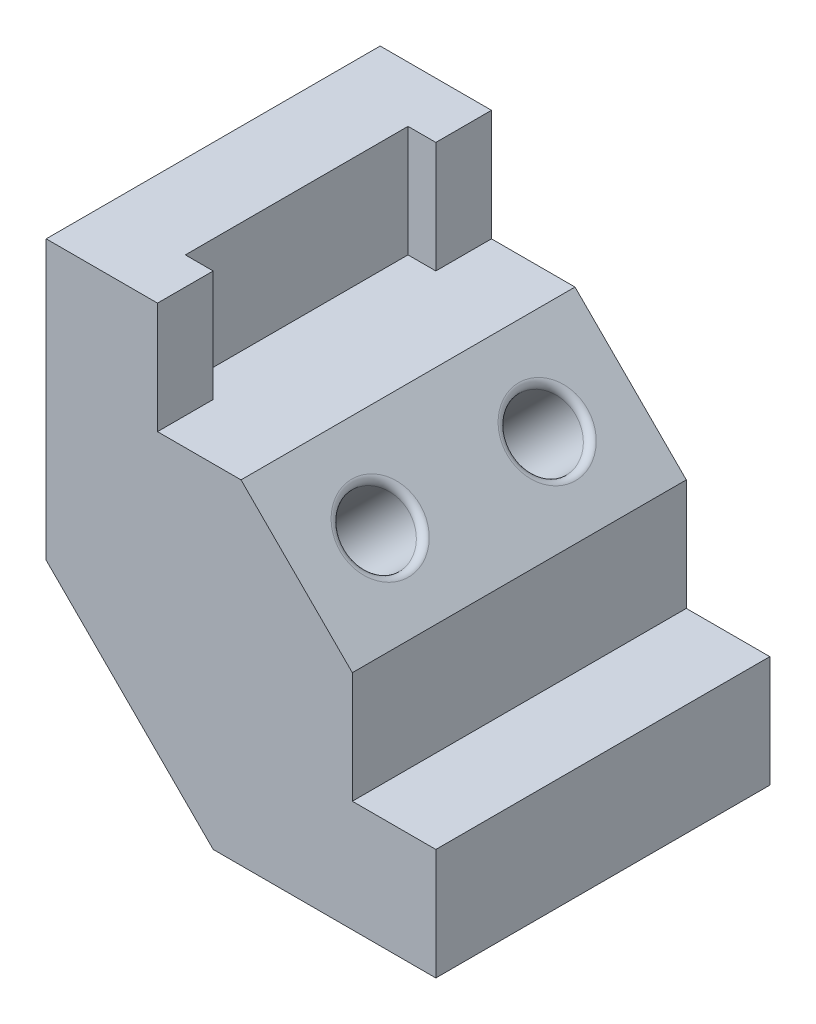
ISO-10303-21;
HEADER;
FILE_DESCRIPTION(('STEP AP214'),'2;1');
FILE_NAME('part.step','',(''),(''),'','','');
FILE_SCHEMA(('AUTOMOTIVE_DESIGN { 1 0 10303 214 1 1 1 1 }'));
ENDSEC;
DATA;
#1=APPLICATION_CONTEXT('core data for automotive mechanical design processes');
#2=APPLICATION_PROTOCOL_DEFINITION('international standard','automotive_design',2000,#1);
#3=PRODUCT_CONTEXT('',#1,'mechanical');
#4=PRODUCT('Part','Part','',(#3));
#5=PRODUCT_RELATED_PRODUCT_CATEGORY('part','',(#4));
#6=PRODUCT_DEFINITION_FORMATION('','',#4);
#7=PRODUCT_DEFINITION_CONTEXT('part definition',#1,'design');
#8=PRODUCT_DEFINITION('design','',#6,#7);
#9=PRODUCT_DEFINITION_SHAPE('','',#8);
#10=(LENGTH_UNIT() NAMED_UNIT(*) SI_UNIT(.MILLI.,.METRE.));
#11=(NAMED_UNIT(*) PLANE_ANGLE_UNIT() SI_UNIT($,.RADIAN.));
#12=(NAMED_UNIT(*) SI_UNIT($,.STERADIAN.) SOLID_ANGLE_UNIT());
#13=UNCERTAINTY_MEASURE_WITH_UNIT(LENGTH_MEASURE(1.E-05),#10,'distance_accuracy_value','');
#14=(GEOMETRIC_REPRESENTATION_CONTEXT(3) GLOBAL_UNCERTAINTY_ASSIGNED_CONTEXT((#13)) GLOBAL_UNIT_ASSIGNED_CONTEXT((#10,
#11,#12)) REPRESENTATION_CONTEXT('',''));
#15=CARTESIAN_POINT('',(0.,0.,0.));
#16=DIRECTION('',(0.,0.,1.));
#17=DIRECTION('',(1.,0.,0.));
#18=AXIS2_PLACEMENT_3D('',#15,#16,#17);
#19=CARTESIAN_POINT('',(25.4,22.9513180452887,-76.2));
#20=DIRECTION('',(1.,0.,0.));
#21=DIRECTION('',(0.,0.,-1.));
#22=AXIS2_PLACEMENT_3D('',#19,#20,#21);
#23=PLANE('',#22);
#24=DIRECTION('',(0.,1.,0.));
#25=VECTOR('',#24,1.);
#26=CARTESIAN_POINT('',(25.4,-28.2440186564071,-63.5));
#27=LINE('',#26,#25);
#28=CARTESIAN_POINT('',(25.4,22.9513180452887,-63.5));
#29=VERTEX_POINT('',#28);
#30=CARTESIAN_POINT('',(25.4,48.3513180452887,-63.5));
#31=VERTEX_POINT('',#30);
#32=EDGE_CURVE('E247',#29,#31,#27,.T.);
#33=ORIENTED_EDGE('',*,*,#32,.F.);
#34=DIRECTION('',(0.,0.,1.));
#35=VECTOR('',#34,1.);
#36=CARTESIAN_POINT('',(25.4,22.9513180452887,-76.2));
#37=LINE('',#36,#35);
#38=CARTESIAN_POINT('',(25.4,22.9513180452887,-76.2));
#39=VERTEX_POINT('',#38);
#40=EDGE_CURVE('E199',#39,#29,#37,.T.);
#41=ORIENTED_EDGE('',*,*,#40,.F.);
#42=DIRECTION('',(0.,1.,0.));
#43=VECTOR('',#42,1.);
#44=CARTESIAN_POINT('',(25.4,22.9513180452887,-76.2));
#45=LINE('',#44,#43);
#46=CARTESIAN_POINT('',(25.4,48.3513180452887,-76.2));
#47=VERTEX_POINT('',#46);
#48=EDGE_CURVE('E158',#39,#47,#45,.T.);
#49=ORIENTED_EDGE('',*,*,#48,.T.);
#50=DIRECTION('',(0.,0.,1.));
#51=VECTOR('',#50,1.);
#52=CARTESIAN_POINT('',(25.4,48.3513180452887,-76.2));
#53=LINE('',#52,#51);
#54=EDGE_CURVE('E63',#47,#31,#53,.T.);
#55=ORIENTED_EDGE('',*,*,#54,.T.);
#56=EDGE_LOOP('',(#33,#41,#49,#55));
#57=FACE_BOUND('',#56,.T.);
#58=ADVANCED_FACE('F39',(#57),#23,.T.);
#59=CARTESIAN_POINT('',(25.4,48.3513180452887,-76.2));
#60=DIRECTION('',(0.,1.,0.));
#61=DIRECTION('',(-1.,0.,0.));
#62=AXIS2_PLACEMENT_3D('',#59,#60,#61);
#63=PLANE('',#62);
#64=DIRECTION('',(-1.,0.,0.));
#65=VECTOR('',#64,1.);
#66=CARTESIAN_POINT('',(25.4,48.3513180452887,-63.5));
#67=LINE('',#66,#65);
#68=CARTESIAN_POINT('',(19.05,48.3513180452887,-63.5));
#69=VERTEX_POINT('',#68);
#70=EDGE_CURVE('E241',#31,#69,#67,.T.);
#71=ORIENTED_EDGE('',*,*,#70,.F.);
#72=ORIENTED_EDGE('',*,*,#54,.F.);
#73=DIRECTION('',(-1.,0.,0.));
#74=VECTOR('',#73,1.);
#75=CARTESIAN_POINT('',(25.4,48.3513180452887,-76.2));
#76=LINE('',#75,#74);
#77=CARTESIAN_POINT('',(0.,48.3513180452887,-76.2));
#78=VERTEX_POINT('',#77);
#79=EDGE_CURVE('E196',#47,#78,#76,.T.);
#80=ORIENTED_EDGE('',*,*,#79,.T.);
#81=DIRECTION('',(0.,0.,1.));
#82=VECTOR('',#81,1.);
#83=CARTESIAN_POINT('',(0.,48.3513180452887,-76.2));
#84=LINE('',#83,#82);
#85=CARTESIAN_POINT('',(0.,48.3513180452887,0.));
#86=VERTEX_POINT('',#85);
#87=EDGE_CURVE('E111',#78,#86,#84,.T.);
#88=ORIENTED_EDGE('',*,*,#87,.T.);
#89=DIRECTION('',(-1.,0.,0.));
#90=VECTOR('',#89,1.);
#91=CARTESIAN_POINT('',(25.4,48.3513180452887,0.));
#92=LINE('',#91,#90);
#93=CARTESIAN_POINT('',(25.4,48.3513180452887,0.));
#94=VERTEX_POINT('',#93);
#95=EDGE_CURVE('E168',#94,#86,#92,.T.);
#96=ORIENTED_EDGE('',*,*,#95,.F.);
#97=CARTESIAN_POINT('',(25.4,48.3513180452887,-12.7));
#98=VERTEX_POINT('',#97);
#99=EDGE_CURVE('E103',#98,#94,#53,.T.);
#100=ORIENTED_EDGE('',*,*,#99,.F.);
#101=DIRECTION('',(1.,0.,0.));
#102=VECTOR('',#101,1.);
#103=CARTESIAN_POINT('',(25.4,48.3513180452887,-12.7));
#104=LINE('',#103,#102);
#105=CARTESIAN_POINT('',(19.05,48.3513180452887,-12.7));
#106=VERTEX_POINT('',#105);
#107=EDGE_CURVE('E255',#106,#98,#104,.T.);
#108=ORIENTED_EDGE('',*,*,#107,.F.);
#109=DIRECTION('',(0.,0.,1.));
#110=VECTOR('',#109,1.);
#111=CARTESIAN_POINT('',(19.05,48.3513180452887,-63.5));
#112=LINE('',#111,#110);
#113=EDGE_CURVE('E252',#69,#106,#112,.T.);
#114=ORIENTED_EDGE('',*,*,#113,.F.);
#115=EDGE_LOOP('',(#71,#72,#80,#88,#96,#100,#108,#114));
#116=FACE_BOUND('',#115,.T.);
#117=ADVANCED_FACE('F298',(#116),#63,.T.);
#118=DIRECTION('',(0.,1.,0.));
#119=VECTOR('',#118,1.);
#120=CARTESIAN_POINT('',(25.4,-28.2440186564071,-12.7));
#121=LINE('',#120,#119);
#122=CARTESIAN_POINT('',(25.4,22.9513180452887,-12.7));
#123=VERTEX_POINT('',#122);
#124=EDGE_CURVE('E54',#123,#98,#121,.T.);
#125=ORIENTED_EDGE('',*,*,#124,.T.);
#126=ORIENTED_EDGE('',*,*,#99,.T.);
#127=DIRECTION('',(0.,1.,0.));
#128=VECTOR('',#127,1.);
#129=CARTESIAN_POINT('',(25.4,22.9513180452887,0.));
#130=LINE('',#129,#128);
#131=CARTESIAN_POINT('',(25.4,22.9513180452887,0.));
#132=VERTEX_POINT('',#131);
#133=EDGE_CURVE('E193',#132,#94,#130,.T.);
#134=ORIENTED_EDGE('',*,*,#133,.F.);
#135=EDGE_CURVE('E148',#123,#132,#37,.T.);
#136=ORIENTED_EDGE('',*,*,#135,.F.);
#137=EDGE_LOOP('',(#125,#126,#134,#136));
#138=FACE_BOUND('',#137,.T.);
#139=ADVANCED_FACE('F304',(#138),#23,.T.);
#140=CARTESIAN_POINT('',(44.45,22.9513180452887,-76.2));
#141=DIRECTION('',(0.,1.,0.));
#142=DIRECTION('',(-1.,0.,0.));
#143=AXIS2_PLACEMENT_3D('',#140,#141,#142);
#144=PLANE('',#143);
#145=DIRECTION('',(-1.,0.,0.));
#146=VECTOR('',#145,1.);
#147=CARTESIAN_POINT('',(44.45,22.9513180452887,0.));
#148=LINE('',#147,#146);
#149=CARTESIAN_POINT('',(44.45,22.9513180452887,0.));
#150=VERTEX_POINT('',#149);
#151=EDGE_CURVE('E143',#150,#132,#148,.T.);
#152=ORIENTED_EDGE('',*,*,#151,.F.);
#153=DIRECTION('',(0.,0.,1.));
#154=VECTOR('',#153,1.);
#155=CARTESIAN_POINT('',(44.45,22.9513180452887,-76.2));
#156=LINE('',#155,#154);
#157=CARTESIAN_POINT('',(44.45,22.9513180452887,-76.2));
#158=VERTEX_POINT('',#157);
#159=EDGE_CURVE('E136',#158,#150,#156,.T.);
#160=ORIENTED_EDGE('',*,*,#159,.F.);
#161=DIRECTION('',(-1.,0.,0.));
#162=VECTOR('',#161,1.);
#163=CARTESIAN_POINT('',(44.45,22.9513180452887,-76.2));
#164=LINE('',#163,#162);
#165=EDGE_CURVE('E140',#158,#39,#164,.T.);
#166=ORIENTED_EDGE('',*,*,#165,.T.);
#167=ORIENTED_EDGE('',*,*,#40,.T.);
#168=DIRECTION('',(1.,0.,0.));
#169=VECTOR('',#168,1.);
#170=CARTESIAN_POINT('',(25.4,22.9513180452887,-63.5));
#171=LINE('',#170,#169);
#172=CARTESIAN_POINT('',(19.05,22.9513180452887,-63.5));
#173=VERTEX_POINT('',#172);
#174=EDGE_CURVE('E246',#173,#29,#171,.T.);
#175=ORIENTED_EDGE('',*,*,#174,.F.);
#176=DIRECTION('',(0.,0.,-1.));
#177=VECTOR('',#176,1.);
#178=CARTESIAN_POINT('',(19.05,22.9513180452887,-63.5));
#179=LINE('',#178,#177);
#180=CARTESIAN_POINT('',(19.05,22.9513180452887,-12.7));
#181=VERTEX_POINT('',#180);
#182=EDGE_CURVE('E172',#181,#173,#179,.T.);
#183=ORIENTED_EDGE('',*,*,#182,.F.);
#184=DIRECTION('',(-1.,0.,0.));
#185=VECTOR('',#184,1.);
#186=CARTESIAN_POINT('',(25.4,22.9513180452887,-12.7));
#187=LINE('',#186,#185);
#188=EDGE_CURVE('E244',#123,#181,#187,.T.);
#189=ORIENTED_EDGE('',*,*,#188,.F.);
#190=ORIENTED_EDGE('',*,*,#135,.T.);
#191=EDGE_LOOP('',(#152,#160,#166,#167,#175,#183,#189,#190));
#192=FACE_BOUND('',#191,.T.);
#193=ADVANCED_FACE('F138',(#192),#144,.T.);
#194=CARTESIAN_POINT('',(69.8499999999999,-2.44868195471128,-76.2));
#195=DIRECTION('',(0.707106781186549,0.707106781186546,0.));
#196=DIRECTION('',(-0.707106781186546,0.707106781186549,0.));
#197=AXIS2_PLACEMENT_3D('',#194,#195,#196);
#198=PLANE('',#197);
#199=CARTESIAN_POINT('',(57.1519178448082,10.2494002004805,-57.15));
#200=DIRECTION('',(0.707106781186549,0.707106781186546,0.));
#201=DIRECTION('',(-0.707106781186546,0.707106781186549,0.));
#202=AXIS2_PLACEMENT_3D('',#199,#200,#201);
#203=CIRCLE('',#202,9.14399999999999);
#204=CARTESIAN_POINT('',(50.6861334376384,16.7151846076503,-57.15));
#205=VERTEX_POINT('',#204);
#206=EDGE_CURVE('E47',#205,#205,#203,.F.);
#207=ORIENTED_EDGE('',*,*,#206,.T.);
#208=EDGE_LOOP('',(#207));
#209=FACE_BOUND('',#208,.T.);
#210=CARTESIAN_POINT('',(57.1519178448082,10.2494002004805,-19.05));
#211=DIRECTION('',(0.707106781186549,0.707106781186546,0.));
#212=DIRECTION('',(-0.707106781186546,0.707106781186549,0.));
#213=AXIS2_PLACEMENT_3D('',#210,#211,#212);
#214=CIRCLE('',#213,9.144);
#215=CARTESIAN_POINT('',(50.6861334376384,16.7151846076503,-19.05));
#216=VERTEX_POINT('',#215);
#217=EDGE_CURVE('E215',#216,#216,#214,.F.);
#218=ORIENTED_EDGE('',*,*,#217,.T.);
#219=EDGE_LOOP('',(#218));
#220=FACE_BOUND('',#219,.T.);
#221=DIRECTION('',(-0.707106781186546,0.707106781186549,0.));
#222=VECTOR('',#221,1.);
#223=CARTESIAN_POINT('',(69.8499999999999,-2.44868195471128,0.));
#224=LINE('',#223,#222);
#225=CARTESIAN_POINT('',(69.8499999999999,-2.44868195471128,0.));
#226=VERTEX_POINT('',#225);
#227=EDGE_CURVE('E190',#226,#150,#224,.T.);
#228=ORIENTED_EDGE('',*,*,#227,.F.);
#229=DIRECTION('',(0.,0.,1.));
#230=VECTOR('',#229,1.);
#231=CARTESIAN_POINT('',(69.8499999999999,-2.44868195471128,-76.2));
#232=LINE('',#231,#230);
#233=CARTESIAN_POINT('',(69.8499999999999,-2.44868195471128,-76.2));
#234=VERTEX_POINT('',#233);
#235=EDGE_CURVE('E149',#234,#226,#232,.T.);
#236=ORIENTED_EDGE('',*,*,#235,.F.);
#237=DIRECTION('',(-0.707106781186546,0.707106781186549,0.));
#238=VECTOR('',#237,1.);
#239=CARTESIAN_POINT('',(69.8499999999999,-2.44868195471128,-76.2));
#240=LINE('',#239,#238);
#241=EDGE_CURVE('E155',#234,#158,#240,.T.);
#242=ORIENTED_EDGE('',*,*,#241,.T.);
#243=ORIENTED_EDGE('',*,*,#159,.T.);
#244=EDGE_LOOP('',(#228,#236,#242,#243));
#245=FACE_BOUND('',#244,.T.);
#246=ADVANCED_FACE('F160',(#209,#220,#245),#198,.T.);
#247=CARTESIAN_POINT('',(69.8499999999999,-27.8486819547113,-76.2));
#248=DIRECTION('',(1.,0.,0.));
#249=DIRECTION('',(0.,0.,-1.));
#250=AXIS2_PLACEMENT_3D('',#247,#248,#249);
#251=PLANE('',#250);
#252=DIRECTION('',(0.,1.,0.));
#253=VECTOR('',#252,1.);
#254=CARTESIAN_POINT('',(69.8499999999999,-27.8486819547113,0.));
#255=LINE('',#254,#253);
#256=CARTESIAN_POINT('',(69.8499999999999,-27.8486819547113,0.));
#257=VERTEX_POINT('',#256);
#258=EDGE_CURVE('E187',#257,#226,#255,.T.);
#259=ORIENTED_EDGE('',*,*,#258,.F.);
#260=DIRECTION('',(0.,0.,1.));
#261=VECTOR('',#260,1.);
#262=CARTESIAN_POINT('',(69.8499999999999,-27.8486819547113,-76.2));
#263=LINE('',#262,#261);
#264=CARTESIAN_POINT('',(69.8499999999999,-27.8486819547113,-76.2));
#265=VERTEX_POINT('',#264);
#266=EDGE_CURVE('E202',#265,#257,#263,.T.);
#267=ORIENTED_EDGE('',*,*,#266,.F.);
#268=DIRECTION('',(0.,1.,0.));
#269=VECTOR('',#268,1.);
#270=CARTESIAN_POINT('',(69.8499999999999,-27.8486819547113,-76.2));
#271=LINE('',#270,#269);
#272=EDGE_CURVE('E161',#265,#234,#271,.T.);
#273=ORIENTED_EDGE('',*,*,#272,.T.);
#274=ORIENTED_EDGE('',*,*,#235,.T.);
#275=EDGE_LOOP('',(#259,#267,#273,#274));
#276=FACE_BOUND('',#275,.T.);
#277=ADVANCED_FACE('F343',(#276),#251,.T.);
#278=CARTESIAN_POINT('',(88.9,-27.8486819547113,-76.2));
#279=DIRECTION('',(0.,1.,0.));
#280=DIRECTION('',(0.,0.,1.));
#281=AXIS2_PLACEMENT_3D('',#278,#279,#280);
#282=PLANE('',#281);
#283=DIRECTION('',(-1.,0.,0.));
#284=VECTOR('',#283,1.);
#285=CARTESIAN_POINT('',(88.9,-27.8486819547113,0.));
#286=LINE('',#285,#284);
#287=CARTESIAN_POINT('',(88.9,-27.8486819547113,0.));
#288=VERTEX_POINT('',#287);
#289=EDGE_CURVE('E184',#288,#257,#286,.T.);
#290=ORIENTED_EDGE('',*,*,#289,.F.);
#291=DIRECTION('',(0.,0.,1.));
#292=VECTOR('',#291,1.);
#293=CARTESIAN_POINT('',(88.9,-27.8486819547113,-76.2));
#294=LINE('',#293,#292);
#295=CARTESIAN_POINT('',(88.9,-27.8486819547113,-76.2));
#296=VERTEX_POINT('',#295);
#297=EDGE_CURVE('E204',#296,#288,#294,.T.);
#298=ORIENTED_EDGE('',*,*,#297,.F.);
#299=DIRECTION('',(-1.,0.,0.));
#300=VECTOR('',#299,1.);
#301=CARTESIAN_POINT('',(88.9,-27.8486819547113,-76.2));
#302=LINE('',#301,#300);
#303=EDGE_CURVE('E163',#296,#265,#302,.T.);
#304=ORIENTED_EDGE('',*,*,#303,.T.);
#305=ORIENTED_EDGE('',*,*,#266,.T.);
#306=EDGE_LOOP('',(#290,#298,#304,#305));
#307=FACE_BOUND('',#306,.T.);
#308=ADVANCED_FACE('F283',(#307),#282,.T.);
#309=CARTESIAN_POINT('',(88.9,-53.2486819547113,-76.2));
#310=DIRECTION('',(1.,0.,0.));
#311=DIRECTION('',(0.,1.,0.));
#312=AXIS2_PLACEMENT_3D('',#309,#310,#311);
#313=PLANE('',#312);
#314=DIRECTION('',(0.,1.,0.));
#315=VECTOR('',#314,1.);
#316=CARTESIAN_POINT('',(88.9,-53.2486819547113,0.));
#317=LINE('',#316,#315);
#318=CARTESIAN_POINT('',(88.9,-53.2486819547113,0.));
#319=VERTEX_POINT('',#318);
#320=EDGE_CURVE('E181',#319,#288,#317,.T.);
#321=ORIENTED_EDGE('',*,*,#320,.F.);
#322=DIRECTION('',(0.,0.,1.));
#323=VECTOR('',#322,1.);
#324=CARTESIAN_POINT('',(88.9,-53.2486819547113,-76.2));
#325=LINE('',#324,#323);
#326=CARTESIAN_POINT('',(88.9,-53.2486819547113,-76.2));
#327=VERTEX_POINT('',#326);
#328=EDGE_CURVE('E206',#327,#319,#325,.T.);
#329=ORIENTED_EDGE('',*,*,#328,.F.);
#330=DIRECTION('',(0.,1.,0.));
#331=VECTOR('',#330,1.);
#332=CARTESIAN_POINT('',(88.9,-53.2486819547113,-76.2));
#333=LINE('',#332,#331);
#334=EDGE_CURVE('E277',#327,#296,#333,.T.);
#335=ORIENTED_EDGE('',*,*,#334,.T.);
#336=ORIENTED_EDGE('',*,*,#297,.T.);
#337=EDGE_LOOP('',(#321,#329,#335,#336));
#338=FACE_BOUND('',#337,.T.);
#339=ADVANCED_FACE('F289',(#338),#313,.T.);
#340=CARTESIAN_POINT('',(38.1,-53.2486819547113,-76.2));
#341=DIRECTION('',(0.,-1.,0.));
#342=DIRECTION('',(1.,0.,0.));
#343=AXIS2_PLACEMENT_3D('',#340,#341,#342);
#344=PLANE('',#343);
#345=DIRECTION('',(1.,0.,0.));
#346=VECTOR('',#345,1.);
#347=CARTESIAN_POINT('',(38.1,-53.2486819547113,0.));
#348=LINE('',#347,#346);
#349=CARTESIAN_POINT('',(38.1,-53.2486819547113,0.));
#350=VERTEX_POINT('',#349);
#351=EDGE_CURVE('E178',#350,#319,#348,.T.);
#352=ORIENTED_EDGE('',*,*,#351,.F.);
#353=DIRECTION('',(0.,0.,1.));
#354=VECTOR('',#353,1.);
#355=CARTESIAN_POINT('',(38.1,-53.2486819547113,-76.2));
#356=LINE('',#355,#354);
#357=CARTESIAN_POINT('',(38.1,-53.2486819547113,-76.2));
#358=VERTEX_POINT('',#357);
#359=EDGE_CURVE('E208',#358,#350,#356,.T.);
#360=ORIENTED_EDGE('',*,*,#359,.F.);
#361=DIRECTION('',(1.,0.,0.));
#362=VECTOR('',#361,1.);
#363=CARTESIAN_POINT('',(38.1,-53.2486819547113,-76.2));
#364=LINE('',#363,#362);
#365=EDGE_CURVE('E274',#358,#327,#364,.T.);
#366=ORIENTED_EDGE('',*,*,#365,.T.);
#367=ORIENTED_EDGE('',*,*,#328,.T.);
#368=EDGE_LOOP('',(#352,#360,#366,#367));
#369=FACE_BOUND('',#368,.T.);
#370=ADVANCED_FACE('F292',(#369),#344,.T.);
#371=CARTESIAN_POINT('',(0.,-15.1486819547111,-76.2));
#372=DIRECTION('',(-0.707106781186549,-0.707106781186546,0.));
#373=DIRECTION('',(0.707106781186546,-0.707106781186549,0.));
#374=AXIS2_PLACEMENT_3D('',#371,#372,#373);
#375=PLANE('',#374);
#376=DIRECTION('',(0.707106781186546,-0.707106781186549,0.));
#377=VECTOR('',#376,1.);
#378=CARTESIAN_POINT('',(0.,-15.1486819547111,0.));
#379=LINE('',#378,#377);
#380=CARTESIAN_POINT('',(0.,-15.1486819547111,0.));
#381=VERTEX_POINT('',#380);
#382=EDGE_CURVE('E175',#381,#350,#379,.T.);
#383=ORIENTED_EDGE('',*,*,#382,.F.);
#384=DIRECTION('',(0.,0.,1.));
#385=VECTOR('',#384,1.);
#386=CARTESIAN_POINT('',(0.,-15.1486819547111,-76.2));
#387=LINE('',#386,#385);
#388=CARTESIAN_POINT('',(0.,-15.1486819547111,-76.2));
#389=VERTEX_POINT('',#388);
#390=EDGE_CURVE('E210',#389,#381,#387,.T.);
#391=ORIENTED_EDGE('',*,*,#390,.F.);
#392=DIRECTION('',(0.707106781186546,-0.707106781186549,0.));
#393=VECTOR('',#392,1.);
#394=CARTESIAN_POINT('',(0.,-15.1486819547111,-76.2));
#395=LINE('',#394,#393);
#396=EDGE_CURVE('E271',#389,#358,#395,.T.);
#397=ORIENTED_EDGE('',*,*,#396,.T.);
#398=ORIENTED_EDGE('',*,*,#359,.T.);
#399=EDGE_LOOP('',(#383,#391,#397,#398));
#400=FACE_BOUND('',#399,.T.);
#401=ADVANCED_FACE('F296',(#400),#375,.T.);
#402=CARTESIAN_POINT('',(0.,48.3513180452887,-76.2));
#403=DIRECTION('',(-1.,0.,0.));
#404=DIRECTION('',(0.,-1.,0.));
#405=AXIS2_PLACEMENT_3D('',#402,#403,#404);
#406=PLANE('',#405);
#407=DIRECTION('',(0.,-1.,0.));
#408=VECTOR('',#407,1.);
#409=CARTESIAN_POINT('',(0.,48.3513180452887,0.));
#410=LINE('',#409,#408);
#411=EDGE_CURVE('E171',#86,#381,#410,.T.);
#412=ORIENTED_EDGE('',*,*,#411,.F.);
#413=ORIENTED_EDGE('',*,*,#87,.F.);
#414=DIRECTION('',(0.,-1.,0.));
#415=VECTOR('',#414,1.);
#416=CARTESIAN_POINT('',(0.,48.3513180452887,-76.2));
#417=LINE('',#416,#415);
#418=EDGE_CURVE('E269',#78,#389,#417,.T.);
#419=ORIENTED_EDGE('',*,*,#418,.T.);
#420=ORIENTED_EDGE('',*,*,#390,.T.);
#421=EDGE_LOOP('',(#412,#413,#419,#420));
#422=FACE_BOUND('',#421,.T.);
#423=ADVANCED_FACE('F297',(#422),#406,.T.);
#424=CARTESIAN_POINT('',(0.,0.,-76.2));
#425=DIRECTION('',(0.,0.,1.));
#426=DIRECTION('',(1.,0.,0.));
#427=AXIS2_PLACEMENT_3D('',#424,#425,#426);
#428=PLANE('',#427);
#429=ORIENTED_EDGE('',*,*,#79,.F.);
#430=ORIENTED_EDGE('',*,*,#48,.F.);
#431=ORIENTED_EDGE('',*,*,#165,.F.);
#432=ORIENTED_EDGE('',*,*,#241,.F.);
#433=ORIENTED_EDGE('',*,*,#272,.F.);
#434=ORIENTED_EDGE('',*,*,#303,.F.);
#435=ORIENTED_EDGE('',*,*,#334,.F.);
#436=ORIENTED_EDGE('',*,*,#365,.F.);
#437=ORIENTED_EDGE('',*,*,#396,.F.);
#438=ORIENTED_EDGE('',*,*,#418,.F.);
#439=EDGE_LOOP('',(#429,#430,#431,#432,#433,#434,#435,#436,#437,#438));
#440=FACE_BOUND('',#439,.T.);
#441=ADVANCED_FACE('F153',(#440),#428,.F.);
#442=CARTESIAN_POINT('',(0.,0.,0.));
#443=DIRECTION('',(0.,0.,1.));
#444=DIRECTION('',(1.,0.,0.));
#445=AXIS2_PLACEMENT_3D('',#442,#443,#444);
#446=PLANE('',#445);
#447=ORIENTED_EDGE('',*,*,#95,.T.);
#448=ORIENTED_EDGE('',*,*,#411,.T.);
#449=ORIENTED_EDGE('',*,*,#382,.T.);
#450=ORIENTED_EDGE('',*,*,#351,.T.);
#451=ORIENTED_EDGE('',*,*,#320,.T.);
#452=ORIENTED_EDGE('',*,*,#289,.T.);
#453=ORIENTED_EDGE('',*,*,#258,.T.);
#454=ORIENTED_EDGE('',*,*,#227,.T.);
#455=ORIENTED_EDGE('',*,*,#151,.T.);
#456=ORIENTED_EDGE('',*,*,#133,.T.);
#457=EDGE_LOOP('',(#447,#448,#449,#450,#451,#452,#453,#454,#455,#456));
#458=FACE_BOUND('',#457,.T.);
#459=ADVANCED_FACE('F302',(#458),#446,.T.);
#460=CARTESIAN_POINT('',(25.4,-28.2440186564071,-63.5));
#461=DIRECTION('',(0.,0.,-1.));
#462=DIRECTION('',(-1.,0.,0.));
#463=AXIS2_PLACEMENT_3D('',#460,#461,#462);
#464=PLANE('',#463);
#465=ORIENTED_EDGE('',*,*,#174,.T.);
#466=ORIENTED_EDGE('',*,*,#32,.T.);
#467=ORIENTED_EDGE('',*,*,#70,.T.);
#468=DIRECTION('',(0.,1.,0.));
#469=VECTOR('',#468,1.);
#470=CARTESIAN_POINT('',(19.05,-28.2440186564071,-63.5));
#471=LINE('',#470,#469);
#472=EDGE_CURVE('E257',#173,#69,#471,.T.);
#473=ORIENTED_EDGE('',*,*,#472,.F.);
#474=EDGE_LOOP('',(#465,#466,#467,#473));
#475=FACE_BOUND('',#474,.T.);
#476=ADVANCED_FACE('F324',(#475),#464,.F.);
#477=CARTESIAN_POINT('',(25.4,-28.2440186564071,-12.7));
#478=DIRECTION('',(0.,0.,1.));
#479=DIRECTION('',(1.,0.,0.));
#480=AXIS2_PLACEMENT_3D('',#477,#478,#479);
#481=PLANE('',#480);
#482=ORIENTED_EDGE('',*,*,#188,.T.);
#483=DIRECTION('',(0.,1.,0.));
#484=VECTOR('',#483,1.);
#485=CARTESIAN_POINT('',(19.05,-28.2440186564071,-12.7));
#486=LINE('',#485,#484);
#487=EDGE_CURVE('E261',#181,#106,#486,.T.);
#488=ORIENTED_EDGE('',*,*,#487,.T.);
#489=ORIENTED_EDGE('',*,*,#107,.T.);
#490=ORIENTED_EDGE('',*,*,#124,.F.);
#491=EDGE_LOOP('',(#482,#488,#489,#490));
#492=FACE_BOUND('',#491,.T.);
#493=ADVANCED_FACE('F309',(#492),#481,.F.);
#494=CARTESIAN_POINT('',(19.05,-28.2440186564071,-63.5));
#495=DIRECTION('',(-1.,0.,0.));
#496=DIRECTION('',(0.,-1.,0.));
#497=AXIS2_PLACEMENT_3D('',#494,#495,#496);
#498=PLANE('',#497);
#499=ORIENTED_EDGE('',*,*,#182,.T.);
#500=ORIENTED_EDGE('',*,*,#472,.T.);
#501=ORIENTED_EDGE('',*,*,#113,.T.);
#502=ORIENTED_EDGE('',*,*,#487,.F.);
#503=EDGE_LOOP('',(#499,#500,#501,#502));
#504=FACE_BOUND('',#503,.T.);
#505=ADVANCED_FACE('F232',(#504),#498,.F.);
#506=CARTESIAN_POINT('',(19.4348421363176,-27.4676755080098,-57.15));
#507=DIRECTION('',(0.707106781186549,0.707106781186546,0.));
#508=DIRECTION('',(-0.707106781186546,0.707106781186549,0.));
#509=AXIS2_PLACEMENT_3D('',#506,#507,#508);
#510=CYLINDRICAL_SURFACE('',#509,7.61999999999999);
#511=CARTESIAN_POINT('',(56.0742871102799,9.17176946595225,-57.15));
#512=DIRECTION('',(0.707106781186549,0.707106781186546,0.));
#513=DIRECTION('',(-0.707106781186546,0.707106781186549,0.));
#514=AXIS2_PLACEMENT_3D('',#511,#512,#513);
#515=CIRCLE('',#514,7.61999999999999);
#516=CARTESIAN_POINT('',(50.6861334376384,14.5599231385937,-57.15));
#517=VERTEX_POINT('',#516);
#518=EDGE_CURVE('E198',#517,#517,#515,.T.);
#519=ORIENTED_EDGE('',*,*,#518,.T.);
#520=EDGE_LOOP('',(#519));
#521=FACE_BOUND('',#520,.T.);
#522=CARTESIAN_POINT('',(19.4348421363176,-27.4676755080098,-57.15));
#523=DIRECTION('',(0.707106781186549,0.707106781186546,0.));
#524=DIRECTION('',(-0.707106781186546,0.707106781186549,0.));
#525=AXIS2_PLACEMENT_3D('',#522,#523,#524);
#526=CIRCLE('',#525,7.61999999999999);
#527=CARTESIAN_POINT('',(14.0466884636762,-22.0795218353684,-57.15));
#528=VERTEX_POINT('',#527);
#529=EDGE_CURVE('E236',#528,#528,#526,.T.);
#530=ORIENTED_EDGE('',*,*,#529,.F.);
#531=EDGE_LOOP('',(#530));
#532=FACE_BOUND('',#531,.T.);
#533=ADVANCED_FACE('F228',(#521,#532),#510,.F.);
#534=CARTESIAN_POINT('',(-4.01641668584606,-4.01641668584606,0.));
#535=DIRECTION('',(0.707106781186549,0.707106781186546,0.));
#536=DIRECTION('',(-0.707106781186546,0.707106781186549,0.));
#537=AXIS2_PLACEMENT_3D('',#534,#535,#536);
#538=PLANE('',#537);
#539=ORIENTED_EDGE('',*,*,#529,.T.);
#540=EDGE_LOOP('',(#539));
#541=FACE_BOUND('',#540,.T.);
#542=ADVANCED_FACE('F231',(#541),#538,.T.);
#543=CARTESIAN_POINT('',(19.4348421363176,-27.4676755080098,-19.05));
#544=DIRECTION('',(0.707106781186549,0.707106781186546,0.));
#545=DIRECTION('',(-0.707106781186546,0.707106781186549,0.));
#546=AXIS2_PLACEMENT_3D('',#543,#544,#545);
#547=CYLINDRICAL_SURFACE('',#546,7.62);
#548=CARTESIAN_POINT('',(56.0742871102799,9.17176946595225,-19.05));
#549=DIRECTION('',(0.707106781186549,0.707106781186546,0.));
#550=DIRECTION('',(-0.707106781186546,0.707106781186549,0.));
#551=AXIS2_PLACEMENT_3D('',#548,#549,#550);
#552=CIRCLE('',#551,7.62);
#553=CARTESIAN_POINT('',(50.6861334376384,14.5599231385938,-19.05));
#554=VERTEX_POINT('',#553);
#555=EDGE_CURVE('E11',#554,#554,#552,.T.);
#556=ORIENTED_EDGE('',*,*,#555,.T.);
#557=EDGE_LOOP('',(#556));
#558=FACE_BOUND('',#557,.T.);
#559=CARTESIAN_POINT('',(19.4348421363176,-27.4676755080098,-19.05));
#560=DIRECTION('',(0.707106781186549,0.707106781186546,0.));
#561=DIRECTION('',(-0.707106781186546,0.707106781186549,0.));
#562=AXIS2_PLACEMENT_3D('',#559,#560,#561);
#563=CIRCLE('',#562,7.62);
#564=CARTESIAN_POINT('',(14.0466884636761,-22.0795218353683,-19.05));
#565=VERTEX_POINT('',#564);
#566=EDGE_CURVE('E238',#565,#565,#563,.T.);
#567=ORIENTED_EDGE('',*,*,#566,.F.);
#568=EDGE_LOOP('',(#567));
#569=FACE_BOUND('',#568,.T.);
#570=ADVANCED_FACE('F372',(#558,#569),#547,.F.);
#571=CARTESIAN_POINT('',(-4.01641668584606,-4.01641668584606,0.));
#572=DIRECTION('',(0.707106781186549,0.707106781186546,0.));
#573=DIRECTION('',(-0.707106781186546,0.707106781186549,0.));
#574=AXIS2_PLACEMENT_3D('',#571,#572,#573);
#575=PLANE('',#574);
#576=ORIENTED_EDGE('',*,*,#566,.T.);
#577=EDGE_LOOP('',(#576));
#578=FACE_BOUND('',#577,.T.);
#579=ADVANCED_FACE('F225',(#578),#575,.T.);
#580=CARTESIAN_POINT('',(56.0742871102799,9.17176946595224,-57.15));
#581=DIRECTION('',(0.707106781186549,0.707106781186546,0.));
#582=DIRECTION('',(-0.707106781186546,0.707106781186549,0.));
#583=AXIS2_PLACEMENT_3D('',#580,#581,#582);
#584=TOROIDAL_SURFACE('',#583,9.14399999999999,1.524);
#585=ORIENTED_EDGE('',*,*,#206,.F.);
#586=EDGE_LOOP('',(#585));
#587=FACE_BOUND('',#586,.T.);
#588=ORIENTED_EDGE('',*,*,#518,.F.);
#589=EDGE_LOOP('',(#588));
#590=FACE_BOUND('',#589,.T.);
#591=ADVANCED_FACE('F222',(#587,#590),#584,.T.);
#592=CARTESIAN_POINT('',(56.0742871102799,9.17176946595225,-19.05));
#593=DIRECTION('',(0.707106781186549,0.707106781186546,0.));
#594=DIRECTION('',(-0.707106781186546,0.707106781186549,0.));
#595=AXIS2_PLACEMENT_3D('',#592,#593,#594);
#596=TOROIDAL_SURFACE('',#595,9.144,1.524);
#597=ORIENTED_EDGE('',*,*,#217,.F.);
#598=EDGE_LOOP('',(#597));
#599=FACE_BOUND('',#598,.T.);
#600=ORIENTED_EDGE('',*,*,#555,.F.);
#601=EDGE_LOOP('',(#600));
#602=FACE_BOUND('',#601,.T.);
#603=ADVANCED_FACE('F41',(#599,#602),#596,.T.);
#604=CLOSED_SHELL('',(#58,#117,#139,#193,#246,#277,#308,#339,#370,#401,#423,#441,#459,#476,#493,
#505,#533,#542,#570,#579,#591,#603));
#605=MANIFOLD_SOLID_BREP('B2',#604);
#606=ADVANCED_BREP_SHAPE_REPRESENTATION('',(#18,#605),#14);
#607=SHAPE_DEFINITION_REPRESENTATION(#9,#606);
ENDSEC;
END-ISO-10303-21;
